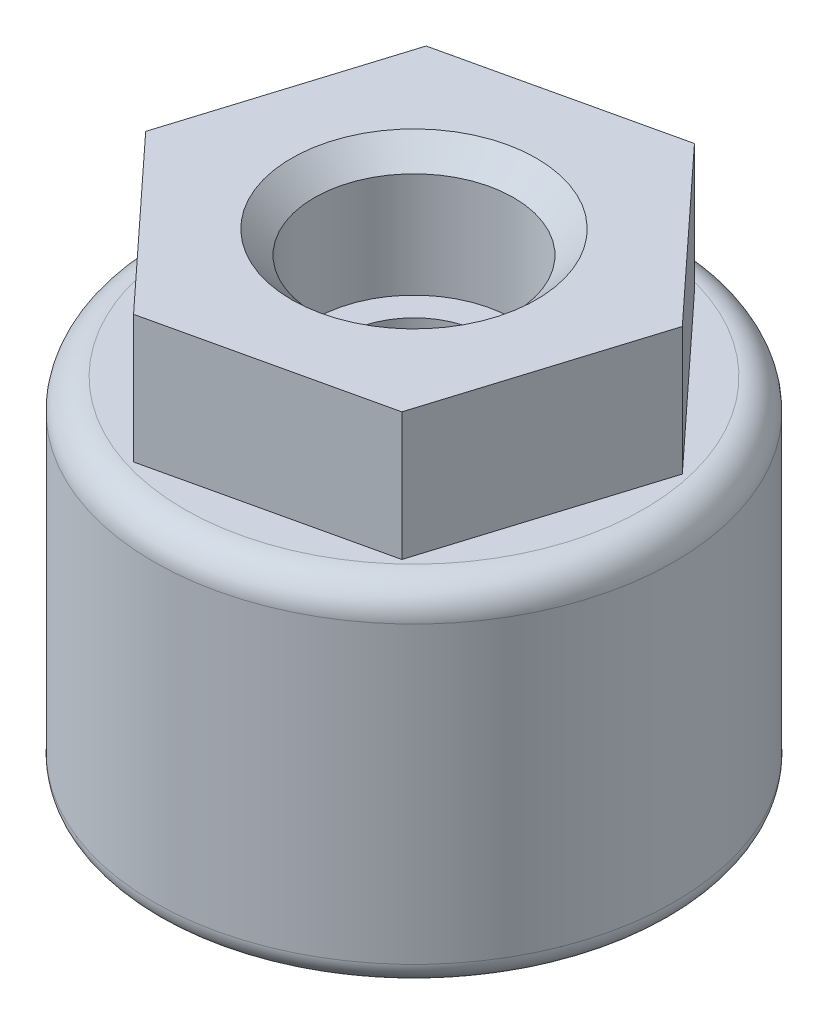
ISO-10303-21;
HEADER;
FILE_DESCRIPTION(('STEP AP214'),'2;1');
FILE_NAME('part.step','',(''),(''),'','','');
FILE_SCHEMA(('AUTOMOTIVE_DESIGN { 1 0 10303 214 1 1 1 1 }'));
ENDSEC;
DATA;
#1=APPLICATION_CONTEXT('core data for automotive mechanical design processes');
#2=APPLICATION_PROTOCOL_DEFINITION('international standard','automotive_design',2000,#1);
#3=PRODUCT_CONTEXT('',#1,'mechanical');
#4=PRODUCT('Part','Part','',(#3));
#5=PRODUCT_RELATED_PRODUCT_CATEGORY('part','',(#4));
#6=PRODUCT_DEFINITION_FORMATION('','',#4);
#7=PRODUCT_DEFINITION_CONTEXT('part definition',#1,'design');
#8=PRODUCT_DEFINITION('design','',#6,#7);
#9=PRODUCT_DEFINITION_SHAPE('','',#8);
#10=(LENGTH_UNIT() NAMED_UNIT(*) SI_UNIT(.MILLI.,.METRE.));
#11=(NAMED_UNIT(*) PLANE_ANGLE_UNIT() SI_UNIT($,.RADIAN.));
#12=(NAMED_UNIT(*) SI_UNIT($,.STERADIAN.) SOLID_ANGLE_UNIT());
#13=UNCERTAINTY_MEASURE_WITH_UNIT(LENGTH_MEASURE(1.E-05),#10,'distance_accuracy_value','');
#14=(GEOMETRIC_REPRESENTATION_CONTEXT(3) GLOBAL_UNCERTAINTY_ASSIGNED_CONTEXT((#13)) GLOBAL_UNIT_ASSIGNED_CONTEXT((#10,
#11,#12)) REPRESENTATION_CONTEXT('',''));
#15=CARTESIAN_POINT('',(0.,0.,0.));
#16=DIRECTION('',(0.,0.,1.));
#17=DIRECTION('',(1.,0.,0.));
#18=AXIS2_PLACEMENT_3D('',#15,#16,#17);
#19=CARTESIAN_POINT('',(0.,28.12,0.));
#20=DIRECTION('',(0.,-1.,0.));
#21=DIRECTION('',(0.,0.,-1.));
#22=AXIS2_PLACEMENT_3D('',#19,#20,#21);
#23=CYLINDRICAL_SURFACE('',#22,3.95);
#24=CARTESIAN_POINT('',(0.,0.,0.));
#25=DIRECTION('',(0.,1.,0.));
#26=DIRECTION('',(0.,0.,1.));
#27=AXIS2_PLACEMENT_3D('',#24,#25,#26);
#28=CIRCLE('',#27,3.95);
#29=CARTESIAN_POINT('',(0.,0.,3.95));
#30=VERTEX_POINT('',#29);
#31=EDGE_CURVE('E124',#30,#30,#28,.F.);
#32=ORIENTED_EDGE('',*,*,#31,.T.);
#33=EDGE_LOOP('',(#32));
#34=FACE_BOUND('',#33,.T.);
#35=CARTESIAN_POINT('',(0.,19.1,0.));
#36=DIRECTION('',(0.,1.,0.));
#37=DIRECTION('',(0.,0.,1.));
#38=AXIS2_PLACEMENT_3D('',#35,#36,#37);
#39=CIRCLE('',#38,3.95);
#40=CARTESIAN_POINT('',(0.,19.1,3.95));
#41=VERTEX_POINT('',#40);
#42=EDGE_CURVE('E153',#41,#41,#39,.T.);
#43=ORIENTED_EDGE('',*,*,#42,.T.);
#44=EDGE_LOOP('',(#43));
#45=FACE_BOUND('',#44,.T.);
#46=ADVANCED_FACE('F36',(#34,#45),#23,.F.);
#47=CARTESIAN_POINT('',(0.,19.1,0.));
#48=DIRECTION('',(0.,1.,0.));
#49=DIRECTION('',(0.,0.,1.));
#50=AXIS2_PLACEMENT_3D('',#47,#48,#49);
#51=PLANE('',#50);
#52=CARTESIAN_POINT('',(0.,19.1,0.));
#53=DIRECTION('',(0.,1.,0.));
#54=DIRECTION('',(0.,0.,1.));
#55=AXIS2_PLACEMENT_3D('',#52,#53,#54);
#56=CIRCLE('',#55,12.615);
#57=CARTESIAN_POINT('',(0.,19.1,12.615));
#58=VERTEX_POINT('',#57);
#59=EDGE_CURVE('E141',#58,#58,#56,.T.);
#60=ORIENTED_EDGE('',*,*,#59,.T.);
#61=EDGE_LOOP('',(#60));
#62=FACE_BOUND('',#61,.T.);
#63=DIRECTION('',(0.295603112883021,0.,-0.955310839284192));
#64=VECTOR('',#63,1.);
#65=CARTESIAN_POINT('',(8.36430826452093,19.1,9.03064120588353));
#66=LINE('',#65,#64);
#67=CARTESIAN_POINT('',(8.36430826452093,19.1,9.03064120588353));
#68=VERTEX_POINT('',#67);
#69=CARTESIAN_POINT('',(12.0029188290181,19.1,-2.72838283921749));
#70=VERTEX_POINT('',#69);
#71=EDGE_CURVE('E123',#68,#70,#66,.T.);
#72=ORIENTED_EDGE('',*,*,#71,.F.);
#73=DIRECTION('',(0.975125011772254,0.,-0.221655614447641));
#74=VECTOR('',#73,1.);
#75=CARTESIAN_POINT('',(-3.63861056449721,19.1,11.759024045101));
#76=LINE('',#75,#74);
#77=CARTESIAN_POINT('',(-3.63861056449721,19.1,11.759024045101));
#78=VERTEX_POINT('',#77);
#79=EDGE_CURVE('E120',#78,#68,#76,.T.);
#80=ORIENTED_EDGE('',*,*,#79,.F.);
#81=DIRECTION('',(0.679521898889233,0.,0.733655224836551));
#82=VECTOR('',#81,1.);
#83=CARTESIAN_POINT('',(-12.0029188290181,19.1,2.7283828392175));
#84=LINE('',#83,#82);
#85=CARTESIAN_POINT('',(-12.0029188290181,19.1,2.7283828392175));
#86=VERTEX_POINT('',#85);
#87=EDGE_CURVE('E79',#86,#78,#84,.T.);
#88=ORIENTED_EDGE('',*,*,#87,.F.);
#89=DIRECTION('',(-0.295603112883021,0.,0.955310839284192));
#90=VECTOR('',#89,1.);
#91=CARTESIAN_POINT('',(-8.36430826452093,19.1,-9.03064120588352));
#92=LINE('',#91,#90);
#93=CARTESIAN_POINT('',(-8.36430826452093,19.1,-9.03064120588352));
#94=VERTEX_POINT('',#93);
#95=EDGE_CURVE('E129',#94,#86,#92,.T.);
#96=ORIENTED_EDGE('',*,*,#95,.F.);
#97=DIRECTION('',(-0.975125011772254,0.,0.221655614447641));
#98=VECTOR('',#97,1.);
#99=CARTESIAN_POINT('',(3.6386105644972,19.1,-11.759024045101));
#100=LINE('',#99,#98);
#101=CARTESIAN_POINT('',(3.6386105644972,19.1,-11.759024045101));
#102=VERTEX_POINT('',#101);
#103=EDGE_CURVE('E109',#102,#94,#100,.T.);
#104=ORIENTED_EDGE('',*,*,#103,.F.);
#105=DIRECTION('',(-0.679521898889233,0.,-0.733655224836551));
#106=VECTOR('',#105,1.);
#107=CARTESIAN_POINT('',(12.0029188290181,19.1,-2.72838283921749));
#108=LINE('',#107,#106);
#109=EDGE_CURVE('E126',#70,#102,#108,.T.);
#110=ORIENTED_EDGE('',*,*,#109,.F.);
#111=EDGE_LOOP('',(#72,#80,#88,#96,#104,#110));
#112=FACE_BOUND('',#111,.T.);
#113=ADVANCED_FACE('F172',(#62,#112),#51,.T.);
#114=CARTESIAN_POINT('',(0.,19.1,0.));
#115=DIRECTION('',(0.,-1.,0.));
#116=DIRECTION('',(0.,0.,-1.));
#117=AXIS2_PLACEMENT_3D('',#114,#115,#116);
#118=CYLINDRICAL_SURFACE('',#117,14.285);
#119=CARTESIAN_POINT('',(0.,1.25,0.));
#120=DIRECTION('',(0.,1.,0.));
#121=DIRECTION('',(0.,0.,1.));
#122=AXIS2_PLACEMENT_3D('',#119,#120,#121);
#123=CIRCLE('',#122,14.285);
#124=CARTESIAN_POINT('',(0.,1.25,14.285));
#125=VERTEX_POINT('',#124);
#126=EDGE_CURVE('E147',#125,#125,#123,.T.);
#127=ORIENTED_EDGE('',*,*,#126,.T.);
#128=EDGE_LOOP('',(#127));
#129=FACE_BOUND('',#128,.T.);
#130=CARTESIAN_POINT('',(0.,17.43,0.));
#131=DIRECTION('',(0.,1.,0.));
#132=DIRECTION('',(0.,0.,1.));
#133=AXIS2_PLACEMENT_3D('',#130,#131,#132);
#134=CIRCLE('',#133,14.285);
#135=CARTESIAN_POINT('',(0.,17.43,14.285));
#136=VERTEX_POINT('',#135);
#137=EDGE_CURVE('E144',#136,#136,#134,.F.);
#138=ORIENTED_EDGE('',*,*,#137,.T.);
#139=EDGE_LOOP('',(#138));
#140=FACE_BOUND('',#139,.T.);
#141=ADVANCED_FACE('F178',(#129,#140),#118,.T.);
#142=CARTESIAN_POINT('',(0.,0.,0.));
#143=DIRECTION('',(0.,1.,0.));
#144=DIRECTION('',(0.,0.,1.));
#145=AXIS2_PLACEMENT_3D('',#142,#143,#144);
#146=PLANE('',#145);
#147=ORIENTED_EDGE('',*,*,#31,.F.);
#148=EDGE_LOOP('',(#147));
#149=FACE_BOUND('',#148,.T.);
#150=CARTESIAN_POINT('',(0.,0.,0.));
#151=DIRECTION('',(0.,1.,0.));
#152=DIRECTION('',(0.,0.,1.));
#153=AXIS2_PLACEMENT_3D('',#150,#151,#152);
#154=CIRCLE('',#153,13.035);
#155=CARTESIAN_POINT('',(0.,0.,13.035));
#156=VERTEX_POINT('',#155);
#157=EDGE_CURVE('E150',#156,#156,#154,.F.);
#158=ORIENTED_EDGE('',*,*,#157,.T.);
#159=EDGE_LOOP('',(#158));
#160=FACE_BOUND('',#159,.T.);
#161=ADVANCED_FACE('F207',(#149,#160),#146,.F.);
#162=CARTESIAN_POINT('',(0.,17.43,0.));
#163=DIRECTION('',(0.,1.,0.));
#164=DIRECTION('',(0.,0.,1.));
#165=AXIS2_PLACEMENT_3D('',#162,#163,#164);
#166=TOROIDAL_SURFACE('',#165,12.615,1.67);
#167=ORIENTED_EDGE('',*,*,#137,.F.);
#168=EDGE_LOOP('',(#167));
#169=FACE_BOUND('',#168,.T.);
#170=ORIENTED_EDGE('',*,*,#59,.F.);
#171=EDGE_LOOP('',(#170));
#172=FACE_BOUND('',#171,.T.);
#173=ADVANCED_FACE('F210',(#169,#172),#166,.T.);
#174=CARTESIAN_POINT('',(0.,1.25,0.));
#175=DIRECTION('',(0.,1.,0.));
#176=DIRECTION('',(0.,0.,1.));
#177=AXIS2_PLACEMENT_3D('',#174,#175,#176);
#178=TOROIDAL_SURFACE('',#177,13.035,1.25);
#179=ORIENTED_EDGE('',*,*,#157,.F.);
#180=EDGE_LOOP('',(#179));
#181=FACE_BOUND('',#180,.T.);
#182=ORIENTED_EDGE('',*,*,#126,.F.);
#183=EDGE_LOOP('',(#182));
#184=FACE_BOUND('',#183,.T.);
#185=ADVANCED_FACE('F204',(#181,#184),#178,.T.);
#186=CARTESIAN_POINT('',(-3.63861056449721,26.12,11.759024045101));
#187=DIRECTION('',(-0.221655614447641,0.,-0.975125011772254));
#188=DIRECTION('',(-0.975125011772254,0.,0.221655614447641));
#189=AXIS2_PLACEMENT_3D('',#186,#187,#188);
#190=PLANE('',#189);
#191=ORIENTED_EDGE('',*,*,#79,.T.);
#192=DIRECTION('',(0.,-1.,0.));
#193=VECTOR('',#192,1.);
#194=CARTESIAN_POINT('',(8.36430826452093,26.12,9.03064120588353));
#195=LINE('',#194,#193);
#196=CARTESIAN_POINT('',(8.36430826452093,26.12,9.03064120588353));
#197=VERTEX_POINT('',#196);
#198=EDGE_CURVE('E139',#197,#68,#195,.T.);
#199=ORIENTED_EDGE('',*,*,#198,.F.);
#200=DIRECTION('',(0.975125011772254,0.,-0.221655614447641));
#201=VECTOR('',#200,1.);
#202=CARTESIAN_POINT('',(-3.63861056449721,26.12,11.759024045101));
#203=LINE('',#202,#201);
#204=CARTESIAN_POINT('',(-3.63861056449721,26.12,11.759024045101));
#205=VERTEX_POINT('',#204);
#206=EDGE_CURVE('E132',#205,#197,#203,.T.);
#207=ORIENTED_EDGE('',*,*,#206,.F.);
#208=DIRECTION('',(0.,-1.,0.));
#209=VECTOR('',#208,1.);
#210=CARTESIAN_POINT('',(-3.63861056449721,26.12,11.759024045101));
#211=LINE('',#210,#209);
#212=EDGE_CURVE('E116',#205,#78,#211,.T.);
#213=ORIENTED_EDGE('',*,*,#212,.T.);
#214=EDGE_LOOP('',(#191,#199,#207,#213));
#215=FACE_BOUND('',#214,.T.);
#216=ADVANCED_FACE('F202',(#215),#190,.F.);
#217=CARTESIAN_POINT('',(8.36430826452093,26.12,9.03064120588353));
#218=DIRECTION('',(-0.955310839284192,0.,-0.295603112883021));
#219=DIRECTION('',(-0.295603112883021,0.,0.955310839284192));
#220=AXIS2_PLACEMENT_3D('',#217,#218,#219);
#221=PLANE('',#220);
#222=ORIENTED_EDGE('',*,*,#71,.T.);
#223=DIRECTION('',(0.,-1.,0.));
#224=VECTOR('',#223,1.);
#225=CARTESIAN_POINT('',(12.0029188290181,26.12,-2.72838283921749));
#226=LINE('',#225,#224);
#227=CARTESIAN_POINT('',(12.0029188290181,26.12,-2.72838283921749));
#228=VERTEX_POINT('',#227);
#229=EDGE_CURVE('E136',#228,#70,#226,.T.);
#230=ORIENTED_EDGE('',*,*,#229,.F.);
#231=DIRECTION('',(0.295603112883021,0.,-0.955310839284192));
#232=VECTOR('',#231,1.);
#233=CARTESIAN_POINT('',(8.36430826452093,26.12,9.03064120588353));
#234=LINE('',#233,#232);
#235=EDGE_CURVE('E87',#197,#228,#234,.T.);
#236=ORIENTED_EDGE('',*,*,#235,.F.);
#237=ORIENTED_EDGE('',*,*,#198,.T.);
#238=EDGE_LOOP('',(#222,#230,#236,#237));
#239=FACE_BOUND('',#238,.T.);
#240=ADVANCED_FACE('F198',(#239),#221,.F.);
#241=CARTESIAN_POINT('',(12.0029188290181,26.12,-2.72838283921749));
#242=DIRECTION('',(-0.733655224836551,0.,0.679521898889233));
#243=DIRECTION('',(0.679521898889233,0.,0.733655224836551));
#244=AXIS2_PLACEMENT_3D('',#241,#242,#243);
#245=PLANE('',#244);
#246=ORIENTED_EDGE('',*,*,#109,.T.);
#247=DIRECTION('',(0.,-1.,0.));
#248=VECTOR('',#247,1.);
#249=CARTESIAN_POINT('',(3.6386105644972,26.12,-11.759024045101));
#250=LINE('',#249,#248);
#251=CARTESIAN_POINT('',(3.6386105644972,26.12,-11.759024045101));
#252=VERTEX_POINT('',#251);
#253=EDGE_CURVE('E112',#252,#102,#250,.T.);
#254=ORIENTED_EDGE('',*,*,#253,.F.);
#255=DIRECTION('',(-0.679521898889233,0.,-0.733655224836551));
#256=VECTOR('',#255,1.);
#257=CARTESIAN_POINT('',(12.0029188290181,26.12,-2.72838283921749));
#258=LINE('',#257,#256);
#259=EDGE_CURVE('E100',#228,#252,#258,.T.);
#260=ORIENTED_EDGE('',*,*,#259,.F.);
#261=ORIENTED_EDGE('',*,*,#229,.T.);
#262=EDGE_LOOP('',(#246,#254,#260,#261));
#263=FACE_BOUND('',#262,.T.);
#264=ADVANCED_FACE('F195',(#263),#245,.F.);
#265=CARTESIAN_POINT('',(3.6386105644972,26.12,-11.759024045101));
#266=DIRECTION('',(0.221655614447641,0.,0.975125011772254));
#267=DIRECTION('',(0.975125011772254,0.,-0.221655614447641));
#268=AXIS2_PLACEMENT_3D('',#265,#266,#267);
#269=PLANE('',#268);
#270=ORIENTED_EDGE('',*,*,#103,.T.);
#271=DIRECTION('',(0.,-1.,0.));
#272=VECTOR('',#271,1.);
#273=CARTESIAN_POINT('',(-8.36430826452093,26.12,-9.03064120588352));
#274=LINE('',#273,#272);
#275=CARTESIAN_POINT('',(-8.36430826452093,26.12,-9.03064120588352));
#276=VERTEX_POINT('',#275);
#277=EDGE_CURVE('E106',#276,#94,#274,.T.);
#278=ORIENTED_EDGE('',*,*,#277,.F.);
#279=DIRECTION('',(-0.975125011772254,0.,0.221655614447641));
#280=VECTOR('',#279,1.);
#281=CARTESIAN_POINT('',(3.6386105644972,26.12,-11.759024045101));
#282=LINE('',#281,#280);
#283=EDGE_CURVE('E94',#252,#276,#282,.T.);
#284=ORIENTED_EDGE('',*,*,#283,.F.);
#285=ORIENTED_EDGE('',*,*,#253,.T.);
#286=EDGE_LOOP('',(#270,#278,#284,#285));
#287=FACE_BOUND('',#286,.T.);
#288=ADVANCED_FACE('F107',(#287),#269,.F.);
#289=CARTESIAN_POINT('',(-8.36430826452093,26.12,-9.03064120588352));
#290=DIRECTION('',(0.955310839284192,0.,0.295603112883021));
#291=DIRECTION('',(0.295603112883021,0.,-0.955310839284192));
#292=AXIS2_PLACEMENT_3D('',#289,#290,#291);
#293=PLANE('',#292);
#294=ORIENTED_EDGE('',*,*,#95,.T.);
#295=DIRECTION('',(0.,-1.,0.));
#296=VECTOR('',#295,1.);
#297=CARTESIAN_POINT('',(-12.0029188290181,26.12,2.7283828392175));
#298=LINE('',#297,#296);
#299=CARTESIAN_POINT('',(-12.0029188290181,26.12,2.7283828392175));
#300=VERTEX_POINT('',#299);
#301=EDGE_CURVE('E51',#300,#86,#298,.T.);
#302=ORIENTED_EDGE('',*,*,#301,.F.);
#303=DIRECTION('',(-0.295603112883021,0.,0.955310839284192));
#304=VECTOR('',#303,1.);
#305=CARTESIAN_POINT('',(-8.36430826452093,26.12,-9.03064120588352));
#306=LINE('',#305,#304);
#307=EDGE_CURVE('E98',#276,#300,#306,.T.);
#308=ORIENTED_EDGE('',*,*,#307,.F.);
#309=ORIENTED_EDGE('',*,*,#277,.T.);
#310=EDGE_LOOP('',(#294,#302,#308,#309));
#311=FACE_BOUND('',#310,.T.);
#312=ADVANCED_FACE('F114',(#311),#293,.F.);
#313=CARTESIAN_POINT('',(-12.0029188290181,26.12,2.7283828392175));
#314=DIRECTION('',(0.733655224836551,0.,-0.679521898889233));
#315=DIRECTION('',(-0.679521898889233,0.,-0.733655224836551));
#316=AXIS2_PLACEMENT_3D('',#313,#314,#315);
#317=PLANE('',#316);
#318=ORIENTED_EDGE('',*,*,#87,.T.);
#319=ORIENTED_EDGE('',*,*,#212,.F.);
#320=DIRECTION('',(0.679521898889233,0.,0.733655224836551));
#321=VECTOR('',#320,1.);
#322=CARTESIAN_POINT('',(-12.0029188290181,26.12,2.7283828392175));
#323=LINE('',#322,#321);
#324=EDGE_CURVE('E59',#300,#205,#323,.T.);
#325=ORIENTED_EDGE('',*,*,#324,.F.);
#326=ORIENTED_EDGE('',*,*,#301,.T.);
#327=EDGE_LOOP('',(#318,#319,#325,#326));
#328=FACE_BOUND('',#327,.T.);
#329=ADVANCED_FACE('F187',(#328),#317,.F.);
#330=CARTESIAN_POINT('',(0.,26.12,0.));
#331=DIRECTION('',(0.,1.,0.));
#332=DIRECTION('',(0.,0.,1.));
#333=AXIS2_PLACEMENT_3D('',#330,#331,#332);
#334=PLANE('',#333);
#335=CARTESIAN_POINT('',(0.,26.12,0.));
#336=DIRECTION('',(0.,1.,0.));
#337=DIRECTION('',(0.,0.,1.));
#338=AXIS2_PLACEMENT_3D('',#335,#336,#337);
#339=CIRCLE('',#338,6.725);
#340=CARTESIAN_POINT('',(0.,26.12,6.725));
#341=VERTEX_POINT('',#340);
#342=EDGE_CURVE('E11',#341,#341,#339,.F.);
#343=ORIENTED_EDGE('',*,*,#342,.T.);
#344=EDGE_LOOP('',(#343));
#345=FACE_BOUND('',#344,.T.);
#346=ORIENTED_EDGE('',*,*,#206,.T.);
#347=ORIENTED_EDGE('',*,*,#235,.T.);
#348=ORIENTED_EDGE('',*,*,#259,.T.);
#349=ORIENTED_EDGE('',*,*,#283,.T.);
#350=ORIENTED_EDGE('',*,*,#307,.T.);
#351=ORIENTED_EDGE('',*,*,#324,.T.);
#352=EDGE_LOOP('',(#346,#347,#348,#349,#350,#351));
#353=FACE_BOUND('',#352,.T.);
#354=ADVANCED_FACE('F96',(#345,#353),#334,.T.);
#355=CARTESIAN_POINT('',(0.,19.1,0.));
#356=DIRECTION('',(0.,1.,0.));
#357=DIRECTION('',(0.,0.,1.));
#358=AXIS2_PLACEMENT_3D('',#355,#356,#357);
#359=CYLINDRICAL_SURFACE('',#358,5.475);
#360=CARTESIAN_POINT('',(0.,24.87,0.));
#361=DIRECTION('',(0.,1.,0.));
#362=DIRECTION('',(0.,0.,1.));
#363=AXIS2_PLACEMENT_3D('',#360,#361,#362);
#364=CIRCLE('',#363,5.475);
#365=CARTESIAN_POINT('',(0.,24.87,5.475));
#366=VERTEX_POINT('',#365);
#367=EDGE_CURVE('E44',#366,#366,#364,.T.);
#368=ORIENTED_EDGE('',*,*,#367,.T.);
#369=EDGE_LOOP('',(#368));
#370=FACE_BOUND('',#369,.T.);
#371=CARTESIAN_POINT('',(0.,19.1,0.));
#372=DIRECTION('',(0.,1.,0.));
#373=DIRECTION('',(0.,0.,1.));
#374=AXIS2_PLACEMENT_3D('',#371,#372,#373);
#375=CIRCLE('',#374,5.475);
#376=CARTESIAN_POINT('',(0.,19.1,5.475));
#377=VERTEX_POINT('',#376);
#378=EDGE_CURVE('E155',#377,#377,#375,.T.);
#379=ORIENTED_EDGE('',*,*,#378,.F.);
#380=EDGE_LOOP('',(#379));
#381=FACE_BOUND('',#380,.T.);
#382=ADVANCED_FACE('F159',(#370,#381),#359,.F.);
#383=CARTESIAN_POINT('',(0.,19.1,0.));
#384=DIRECTION('',(0.,1.,0.));
#385=DIRECTION('',(0.,0.,1.));
#386=AXIS2_PLACEMENT_3D('',#383,#384,#385);
#387=PLANE('',#386);
#388=ORIENTED_EDGE('',*,*,#42,.F.);
#389=EDGE_LOOP('',(#388));
#390=FACE_BOUND('',#389,.T.);
#391=ORIENTED_EDGE('',*,*,#378,.T.);
#392=EDGE_LOOP('',(#391));
#393=FACE_BOUND('',#392,.T.);
#394=ADVANCED_FACE('F163',(#390,#393),#387,.T.);
#395=CARTESIAN_POINT('',(0.,24.87,0.));
#396=DIRECTION('',(0.,1.,0.));
#397=DIRECTION('',(0.,0.,1.));
#398=AXIS2_PLACEMENT_3D('',#395,#396,#397);
#399=CONICAL_SURFACE('',#398,5.475,0.785398163397451);
#400=ORIENTED_EDGE('',*,*,#342,.F.);
#401=EDGE_LOOP('',(#400));
#402=FACE_BOUND('',#401,.T.);
#403=ORIENTED_EDGE('',*,*,#367,.F.);
#404=EDGE_LOOP('',(#403));
#405=FACE_BOUND('',#404,.T.);
#406=ADVANCED_FACE('F38',(#402,#405),#399,.F.);
#407=CLOSED_SHELL('',(#46,#113,#141,#161,#173,#185,#216,#240,#264,#288,#312,#329,#354,#382,#394,#406));
#408=MANIFOLD_SOLID_BREP('B2',#407);
#409=ADVANCED_BREP_SHAPE_REPRESENTATION('',(#18,#408),#14);
#410=SHAPE_DEFINITION_REPRESENTATION(#9,#409);
ENDSEC;
END-ISO-10303-21;
